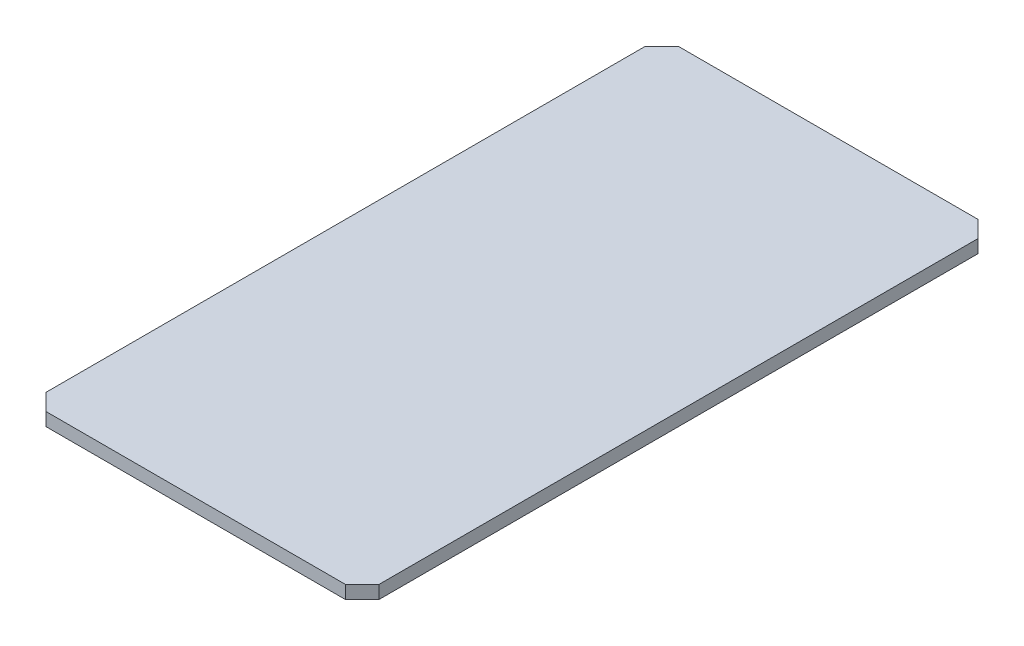
ISO-10303-21;
HEADER;
FILE_DESCRIPTION(('STEP AP214'),'2;1');
FILE_NAME('part.step','',(''),(''),'','','');
FILE_SCHEMA(('AUTOMOTIVE_DESIGN { 1 0 10303 214 1 1 1 1 }'));
ENDSEC;
DATA;
#1=APPLICATION_CONTEXT('core data for automotive mechanical design processes');
#2=APPLICATION_PROTOCOL_DEFINITION('international standard','automotive_design',2000,#1);
#3=PRODUCT_CONTEXT('',#1,'mechanical');
#4=PRODUCT('Part','Part','',(#3));
#5=PRODUCT_RELATED_PRODUCT_CATEGORY('part','',(#4));
#6=PRODUCT_DEFINITION_FORMATION('','',#4);
#7=PRODUCT_DEFINITION_CONTEXT('part definition',#1,'design');
#8=PRODUCT_DEFINITION('design','',#6,#7);
#9=PRODUCT_DEFINITION_SHAPE('','',#8);
#10=(LENGTH_UNIT() NAMED_UNIT(*) SI_UNIT(.MILLI.,.METRE.));
#11=(NAMED_UNIT(*) PLANE_ANGLE_UNIT() SI_UNIT($,.RADIAN.));
#12=(NAMED_UNIT(*) SI_UNIT($,.STERADIAN.) SOLID_ANGLE_UNIT());
#13=UNCERTAINTY_MEASURE_WITH_UNIT(LENGTH_MEASURE(1.E-05),#10,'distance_accuracy_value','');
#14=(GEOMETRIC_REPRESENTATION_CONTEXT(3) GLOBAL_UNCERTAINTY_ASSIGNED_CONTEXT((#13)) GLOBAL_UNIT_ASSIGNED_CONTEXT((#10,
#11,#12)) REPRESENTATION_CONTEXT('',''));
#15=CARTESIAN_POINT('',(0.,0.,0.));
#16=DIRECTION('',(0.,0.,1.));
#17=DIRECTION('',(1.,0.,0.));
#18=AXIS2_PLACEMENT_3D('',#15,#16,#17);
#19=CARTESIAN_POINT('',(-30.1400487313075,1.,-36.8545061847322));
#20=DIRECTION('',(0.,0.,1.));
#21=DIRECTION('',(1.,0.,0.));
#22=AXIS2_PLACEMENT_3D('',#19,#20,#21);
#23=PLANE('',#22);
#24=DIRECTION('',(-1.,0.,0.));
#25=VECTOR('',#24,1.);
#26=CARTESIAN_POINT('',(-30.1400487313075,0.,-36.8545061847322));
#27=LINE('',#26,#25);
#28=CARTESIAN_POINT('',(-7.28004873130748,0.,-36.8545061847322));
#29=VERTEX_POINT('',#28);
#30=CARTESIAN_POINT('',(-30.1400487313075,0.,-36.8545061847322));
#31=VERTEX_POINT('',#30);
#32=EDGE_CURVE('E128',#29,#31,#27,.T.);
#33=ORIENTED_EDGE('',*,*,#32,.T.);
#34=DIRECTION('',(0.,-1.,0.));
#35=VECTOR('',#34,1.);
#36=CARTESIAN_POINT('',(-30.1400487313075,1.,-36.8545061847322));
#37=LINE('',#36,#35);
#38=CARTESIAN_POINT('',(-30.1400487313075,1.,-36.8545061847322));
#39=VERTEX_POINT('',#38);
#40=EDGE_CURVE('E11',#39,#31,#37,.T.);
#41=ORIENTED_EDGE('',*,*,#40,.F.);
#42=DIRECTION('',(-1.,0.,0.));
#43=VECTOR('',#42,1.);
#44=CARTESIAN_POINT('',(-30.1400487313075,1.,-36.8545061847322));
#45=LINE('',#44,#43);
#46=CARTESIAN_POINT('',(-7.28004873130748,1.,-36.8545061847322));
#47=VERTEX_POINT('',#46);
#48=EDGE_CURVE('E142',#47,#39,#45,.T.);
#49=ORIENTED_EDGE('',*,*,#48,.F.);
#50=DIRECTION('',(0.,-1.,0.));
#51=VECTOR('',#50,1.);
#52=CARTESIAN_POINT('',(-7.28004873130748,1.,-36.8545061847322));
#53=LINE('',#52,#51);
#54=EDGE_CURVE('E124',#47,#29,#53,.T.);
#55=ORIENTED_EDGE('',*,*,#54,.T.);
#56=EDGE_LOOP('',(#33,#41,#49,#55));
#57=FACE_BOUND('',#56,.T.);
#58=ADVANCED_FACE('F32',(#57),#23,.F.);
#59=CARTESIAN_POINT('',(-31.4100487313075,1.,-35.5845061847322));
#60=DIRECTION('',(0.707106781186547,0.,0.707106781186547));
#61=DIRECTION('',(0.707106781186548,0.,-0.707106781186548));
#62=AXIS2_PLACEMENT_3D('',#59,#60,#61);
#63=PLANE('',#62);
#64=DIRECTION('',(-0.707106781186548,0.,0.707106781186548));
#65=VECTOR('',#64,1.);
#66=CARTESIAN_POINT('',(-31.4100487313075,0.,-35.5845061847322));
#67=LINE('',#66,#65);
#68=CARTESIAN_POINT('',(-31.4100487313075,0.,-35.5845061847322));
#69=VERTEX_POINT('',#68);
#70=EDGE_CURVE('E131',#31,#69,#67,.T.);
#71=ORIENTED_EDGE('',*,*,#70,.T.);
#72=DIRECTION('',(0.,-1.,0.));
#73=VECTOR('',#72,1.);
#74=CARTESIAN_POINT('',(-31.4100487313075,1.,-35.5845061847322));
#75=LINE('',#74,#73);
#76=CARTESIAN_POINT('',(-31.4100487313075,1.,-35.5845061847322));
#77=VERTEX_POINT('',#76);
#78=EDGE_CURVE('E40',#77,#69,#75,.T.);
#79=ORIENTED_EDGE('',*,*,#78,.F.);
#80=DIRECTION('',(-0.707106781186548,0.,0.707106781186548));
#81=VECTOR('',#80,1.);
#82=CARTESIAN_POINT('',(-31.4100487313075,1.,-35.5845061847322));
#83=LINE('',#82,#81);
#84=EDGE_CURVE('E91',#39,#77,#83,.T.);
#85=ORIENTED_EDGE('',*,*,#84,.F.);
#86=ORIENTED_EDGE('',*,*,#40,.T.);
#87=EDGE_LOOP('',(#71,#79,#85,#86));
#88=FACE_BOUND('',#87,.T.);
#89=ADVANCED_FACE('F177',(#88),#63,.F.);
#90=CARTESIAN_POINT('',(-31.4100487313075,1.,-35.5845061847322));
#91=DIRECTION('',(1.,0.,0.));
#92=DIRECTION('',(0.,0.,-1.));
#93=AXIS2_PLACEMENT_3D('',#90,#91,#92);
#94=PLANE('',#93);
#95=DIRECTION('',(0.,0.,1.));
#96=VECTOR('',#95,1.);
#97=CARTESIAN_POINT('',(-31.4100487313075,0.,-35.5845061847322));
#98=LINE('',#97,#96);
#99=CARTESIAN_POINT('',(-31.4100487313075,0.,10.1354938152678));
#100=VERTEX_POINT('',#99);
#101=EDGE_CURVE('E133',#69,#100,#98,.T.);
#102=ORIENTED_EDGE('',*,*,#101,.T.);
#103=DIRECTION('',(0.,-1.,0.));
#104=VECTOR('',#103,1.);
#105=CARTESIAN_POINT('',(-31.4100487313075,1.,10.1354938152678));
#106=LINE('',#105,#104);
#107=CARTESIAN_POINT('',(-31.4100487313075,1.,10.1354938152678));
#108=VERTEX_POINT('',#107);
#109=EDGE_CURVE('E149',#108,#100,#106,.T.);
#110=ORIENTED_EDGE('',*,*,#109,.F.);
#111=DIRECTION('',(0.,0.,1.));
#112=VECTOR('',#111,1.);
#113=CARTESIAN_POINT('',(-31.4100487313075,1.,-35.5845061847322));
#114=LINE('',#113,#112);
#115=EDGE_CURVE('E157',#77,#108,#114,.T.);
#116=ORIENTED_EDGE('',*,*,#115,.F.);
#117=ORIENTED_EDGE('',*,*,#78,.T.);
#118=EDGE_LOOP('',(#102,#110,#116,#117));
#119=FACE_BOUND('',#118,.T.);
#120=ADVANCED_FACE('F155',(#119),#94,.F.);
#121=CARTESIAN_POINT('',(-31.4100487313075,1.,10.1354938152678));
#122=DIRECTION('',(0.707106781186546,0.,-0.70710678118655));
#123=DIRECTION('',(-0.70710678118655,0.,-0.707106781186546));
#124=AXIS2_PLACEMENT_3D('',#121,#122,#123);
#125=PLANE('',#124);
#126=DIRECTION('',(0.70710678118655,0.,0.707106781186546));
#127=VECTOR('',#126,1.);
#128=CARTESIAN_POINT('',(-31.4100487313075,0.,10.1354938152678));
#129=LINE('',#128,#127);
#130=CARTESIAN_POINT('',(-30.1400487313075,0.,11.4054938152678));
#131=VERTEX_POINT('',#130);
#132=EDGE_CURVE('E135',#100,#131,#129,.T.);
#133=ORIENTED_EDGE('',*,*,#132,.T.);
#134=DIRECTION('',(0.,-1.,0.));
#135=VECTOR('',#134,1.);
#136=CARTESIAN_POINT('',(-30.1400487313075,1.,11.4054938152678));
#137=LINE('',#136,#135);
#138=CARTESIAN_POINT('',(-30.1400487313075,1.,11.4054938152678));
#139=VERTEX_POINT('',#138);
#140=EDGE_CURVE('E146',#139,#131,#137,.T.);
#141=ORIENTED_EDGE('',*,*,#140,.F.);
#142=DIRECTION('',(0.70710678118655,0.,0.707106781186546));
#143=VECTOR('',#142,1.);
#144=CARTESIAN_POINT('',(-31.4100487313075,1.,10.1354938152678));
#145=LINE('',#144,#143);
#146=EDGE_CURVE('E169',#108,#139,#145,.T.);
#147=ORIENTED_EDGE('',*,*,#146,.F.);
#148=ORIENTED_EDGE('',*,*,#109,.T.);
#149=EDGE_LOOP('',(#133,#141,#147,#148));
#150=FACE_BOUND('',#149,.T.);
#151=ADVANCED_FACE('F165',(#150),#125,.F.);
#152=CARTESIAN_POINT('',(-30.1400487313075,1.,11.4054938152678));
#153=DIRECTION('',(0.,0.,-1.));
#154=DIRECTION('',(-1.,0.,0.));
#155=AXIS2_PLACEMENT_3D('',#152,#153,#154);
#156=PLANE('',#155);
#157=DIRECTION('',(1.,0.,0.));
#158=VECTOR('',#157,1.);
#159=CARTESIAN_POINT('',(-30.1400487313075,0.,11.4054938152678));
#160=LINE('',#159,#158);
#161=CARTESIAN_POINT('',(-7.28004873130748,0.,11.4054938152678));
#162=VERTEX_POINT('',#161);
#163=EDGE_CURVE('E137',#131,#162,#160,.T.);
#164=ORIENTED_EDGE('',*,*,#163,.T.);
#165=DIRECTION('',(0.,-1.,0.));
#166=VECTOR('',#165,1.);
#167=CARTESIAN_POINT('',(-7.28004873130748,1.,11.4054938152678));
#168=LINE('',#167,#166);
#169=CARTESIAN_POINT('',(-7.28004873130748,1.,11.4054938152678));
#170=VERTEX_POINT('',#169);
#171=EDGE_CURVE('E119',#170,#162,#168,.T.);
#172=ORIENTED_EDGE('',*,*,#171,.F.);
#173=DIRECTION('',(1.,0.,0.));
#174=VECTOR('',#173,1.);
#175=CARTESIAN_POINT('',(-30.1400487313075,1.,11.4054938152678));
#176=LINE('',#175,#174);
#177=EDGE_CURVE('E110',#139,#170,#176,.T.);
#178=ORIENTED_EDGE('',*,*,#177,.F.);
#179=ORIENTED_EDGE('',*,*,#140,.T.);
#180=EDGE_LOOP('',(#164,#172,#178,#179));
#181=FACE_BOUND('',#180,.T.);
#182=ADVANCED_FACE('F168',(#181),#156,.F.);
#183=CARTESIAN_POINT('',(-6.01004873130748,1.,10.1354938152678));
#184=DIRECTION('',(-0.707106781186547,0.,-0.707106781186548));
#185=DIRECTION('',(-0.707106781186548,0.,0.707106781186547));
#186=AXIS2_PLACEMENT_3D('',#183,#184,#185);
#187=PLANE('',#186);
#188=DIRECTION('',(0.707106781186548,0.,-0.707106781186547));
#189=VECTOR('',#188,1.);
#190=CARTESIAN_POINT('',(-6.01004873130748,0.,10.1354938152678));
#191=LINE('',#190,#189);
#192=CARTESIAN_POINT('',(-6.01004873130748,0.,10.1354938152678));
#193=VERTEX_POINT('',#192);
#194=EDGE_CURVE('E118',#162,#193,#191,.T.);
#195=ORIENTED_EDGE('',*,*,#194,.T.);
#196=DIRECTION('',(0.,-1.,0.));
#197=VECTOR('',#196,1.);
#198=CARTESIAN_POINT('',(-6.01004873130748,1.,10.1354938152678));
#199=LINE('',#198,#197);
#200=CARTESIAN_POINT('',(-6.01004873130748,1.,10.1354938152678));
#201=VERTEX_POINT('',#200);
#202=EDGE_CURVE('E115',#201,#193,#199,.T.);
#203=ORIENTED_EDGE('',*,*,#202,.F.);
#204=DIRECTION('',(0.707106781186548,0.,-0.707106781186547));
#205=VECTOR('',#204,1.);
#206=CARTESIAN_POINT('',(-6.01004873130748,1.,10.1354938152678));
#207=LINE('',#206,#205);
#208=EDGE_CURVE('E104',#170,#201,#207,.T.);
#209=ORIENTED_EDGE('',*,*,#208,.F.);
#210=ORIENTED_EDGE('',*,*,#171,.T.);
#211=EDGE_LOOP('',(#195,#203,#209,#210));
#212=FACE_BOUND('',#211,.T.);
#213=ADVANCED_FACE('F116',(#212),#187,.F.);
#214=CARTESIAN_POINT('',(-6.01004873130748,1.,-35.5845061847322));
#215=DIRECTION('',(-1.,0.,0.));
#216=DIRECTION('',(0.,0.,1.));
#217=AXIS2_PLACEMENT_3D('',#214,#215,#216);
#218=PLANE('',#217);
#219=DIRECTION('',(0.,0.,-1.));
#220=VECTOR('',#219,1.);
#221=CARTESIAN_POINT('',(-6.01004873130748,0.,-35.5845061847322));
#222=LINE('',#221,#220);
#223=CARTESIAN_POINT('',(-6.01004873130748,0.,-35.5845061847322));
#224=VERTEX_POINT('',#223);
#225=EDGE_CURVE('E77',#193,#224,#222,.T.);
#226=ORIENTED_EDGE('',*,*,#225,.T.);
#227=DIRECTION('',(0.,-1.,0.));
#228=VECTOR('',#227,1.);
#229=CARTESIAN_POINT('',(-6.01004873130748,1.,-35.5845061847322));
#230=LINE('',#229,#228);
#231=CARTESIAN_POINT('',(-6.01004873130748,1.,-35.5845061847322));
#232=VERTEX_POINT('',#231);
#233=EDGE_CURVE('E120',#232,#224,#230,.T.);
#234=ORIENTED_EDGE('',*,*,#233,.F.);
#235=DIRECTION('',(0.,0.,-1.));
#236=VECTOR('',#235,1.);
#237=CARTESIAN_POINT('',(-6.01004873130748,1.,-35.5845061847322));
#238=LINE('',#237,#236);
#239=EDGE_CURVE('E108',#201,#232,#238,.T.);
#240=ORIENTED_EDGE('',*,*,#239,.F.);
#241=ORIENTED_EDGE('',*,*,#202,.T.);
#242=EDGE_LOOP('',(#226,#234,#240,#241));
#243=FACE_BOUND('',#242,.T.);
#244=ADVANCED_FACE('F122',(#243),#218,.F.);
#245=CARTESIAN_POINT('',(-7.28004873130748,1.,-36.8545061847322));
#246=DIRECTION('',(-0.707106781186547,0.,0.707106781186548));
#247=DIRECTION('',(0.707106781186548,0.,0.707106781186547));
#248=AXIS2_PLACEMENT_3D('',#245,#246,#247);
#249=PLANE('',#248);
#250=DIRECTION('',(-0.707106781186548,0.,-0.707106781186547));
#251=VECTOR('',#250,1.);
#252=CARTESIAN_POINT('',(-7.28004873130748,0.,-36.8545061847322));
#253=LINE('',#252,#251);
#254=EDGE_CURVE('E83',#224,#29,#253,.T.);
#255=ORIENTED_EDGE('',*,*,#254,.T.);
#256=ORIENTED_EDGE('',*,*,#54,.F.);
#257=DIRECTION('',(-0.707106781186548,0.,-0.707106781186547));
#258=VECTOR('',#257,1.);
#259=CARTESIAN_POINT('',(-7.28004873130748,1.,-36.8545061847322));
#260=LINE('',#259,#258);
#261=EDGE_CURVE('E48',#232,#47,#260,.T.);
#262=ORIENTED_EDGE('',*,*,#261,.F.);
#263=ORIENTED_EDGE('',*,*,#233,.T.);
#264=EDGE_LOOP('',(#255,#256,#262,#263));
#265=FACE_BOUND('',#264,.T.);
#266=ADVANCED_FACE('F193',(#265),#249,.F.);
#267=CARTESIAN_POINT('',(0.,1.,0.));
#268=DIRECTION('',(0.,-1.,0.));
#269=DIRECTION('',(0.,0.,-1.));
#270=AXIS2_PLACEMENT_3D('',#267,#268,#269);
#271=PLANE('',#270);
#272=ORIENTED_EDGE('',*,*,#48,.T.);
#273=ORIENTED_EDGE('',*,*,#84,.T.);
#274=ORIENTED_EDGE('',*,*,#115,.T.);
#275=ORIENTED_EDGE('',*,*,#146,.T.);
#276=ORIENTED_EDGE('',*,*,#177,.T.);
#277=ORIENTED_EDGE('',*,*,#208,.T.);
#278=ORIENTED_EDGE('',*,*,#239,.T.);
#279=ORIENTED_EDGE('',*,*,#261,.T.);
#280=EDGE_LOOP('',(#272,#273,#274,#275,#276,#277,#278,#279));
#281=FACE_BOUND('',#280,.T.);
#282=ADVANCED_FACE('F106',(#281),#271,.F.);
#283=CARTESIAN_POINT('',(0.,0.,0.));
#284=DIRECTION('',(0.,-1.,0.));
#285=DIRECTION('',(0.,0.,-1.));
#286=AXIS2_PLACEMENT_3D('',#283,#284,#285);
#287=PLANE('',#286);
#288=ORIENTED_EDGE('',*,*,#32,.F.);
#289=ORIENTED_EDGE('',*,*,#254,.F.);
#290=ORIENTED_EDGE('',*,*,#225,.F.);
#291=ORIENTED_EDGE('',*,*,#194,.F.);
#292=ORIENTED_EDGE('',*,*,#163,.F.);
#293=ORIENTED_EDGE('',*,*,#132,.F.);
#294=ORIENTED_EDGE('',*,*,#101,.F.);
#295=ORIENTED_EDGE('',*,*,#70,.F.);
#296=EDGE_LOOP('',(#288,#289,#290,#291,#292,#293,#294,#295));
#297=FACE_BOUND('',#296,.T.);
#298=ADVANCED_FACE('F161',(#297),#287,.T.);
#299=CLOSED_SHELL('',(#58,#89,#120,#151,#182,#213,#244,#266,#282,#298));
#300=MANIFOLD_SOLID_BREP('B2',#299);
#301=ADVANCED_BREP_SHAPE_REPRESENTATION('',(#18,#300),#14);
#302=SHAPE_DEFINITION_REPRESENTATION(#9,#301);
ENDSEC;
END-ISO-10303-21;
